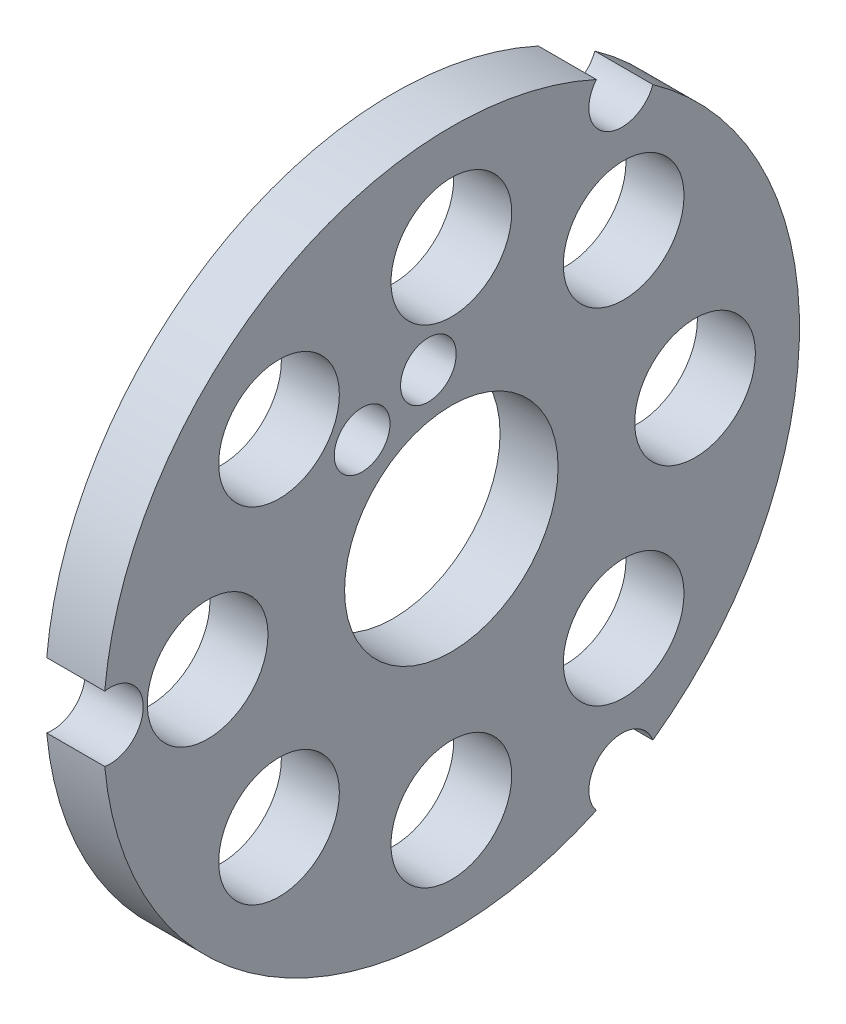
ISO-10303-21;
HEADER;
FILE_DESCRIPTION(('STEP AP214'),'2;1');
FILE_NAME('part.step','',(''),(''),'','','');
FILE_SCHEMA(('AUTOMOTIVE_DESIGN { 1 0 10303 214 1 1 1 1 }'));
ENDSEC;
DATA;
#1=APPLICATION_CONTEXT('core data for automotive mechanical design processes');
#2=APPLICATION_PROTOCOL_DEFINITION('international standard','automotive_design',2000,#1);
#3=PRODUCT_CONTEXT('',#1,'mechanical');
#4=PRODUCT('Part','Part','',(#3));
#5=PRODUCT_RELATED_PRODUCT_CATEGORY('part','',(#4));
#6=PRODUCT_DEFINITION_FORMATION('','',#4);
#7=PRODUCT_DEFINITION_CONTEXT('part definition',#1,'design');
#8=PRODUCT_DEFINITION('design','',#6,#7);
#9=PRODUCT_DEFINITION_SHAPE('','',#8);
#10=(LENGTH_UNIT() NAMED_UNIT(*) SI_UNIT(.MILLI.,.METRE.));
#11=(NAMED_UNIT(*) PLANE_ANGLE_UNIT() SI_UNIT($,.RADIAN.));
#12=(NAMED_UNIT(*) SI_UNIT($,.STERADIAN.) SOLID_ANGLE_UNIT());
#13=UNCERTAINTY_MEASURE_WITH_UNIT(LENGTH_MEASURE(1.E-05),#10,'distance_accuracy_value','');
#14=(GEOMETRIC_REPRESENTATION_CONTEXT(3) GLOBAL_UNCERTAINTY_ASSIGNED_CONTEXT((#13)) GLOBAL_UNIT_ASSIGNED_CONTEXT((#10,
#11,#12)) REPRESENTATION_CONTEXT('',''));
#15=CARTESIAN_POINT('',(0.,0.,0.));
#16=DIRECTION('',(0.,0.,1.));
#17=DIRECTION('',(1.,0.,0.));
#18=AXIS2_PLACEMENT_3D('',#15,#16,#17);
#19=CARTESIAN_POINT('',(-110.,0.,0.));
#20=DIRECTION('',(-1.,0.,0.));
#21=DIRECTION('',(0.,0.,1.));
#22=AXIS2_PLACEMENT_3D('',#19,#20,#21);
#23=CYLINDRICAL_SURFACE('',#22,30.);
#24=DIRECTION('',(-1.,0.,0.));
#25=VECTOR('',#24,1.);
#26=CARTESIAN_POINT('',(74.35,2.8113146971295,29.8679846938776));
#27=LINE('',#26,#25);
#28=CARTESIAN_POINT('',(148.7,2.8113146971295,29.8679846938776));
#29=VERTEX_POINT('',#28);
#30=CARTESIAN_POINT('',(143.7,2.81131469712949,29.8679846938776));
#31=VERTEX_POINT('',#30);
#32=EDGE_CURVE('E11',#29,#31,#27,.T.);
#33=ORIENTED_EDGE('',*,*,#32,.F.);
#34=CARTESIAN_POINT('',(148.7,0.,0.));
#35=DIRECTION('',(-1.,0.,0.));
#36=DIRECTION('',(0.,0.,1.));
#37=AXIS2_PLACEMENT_3D('',#34,#35,#36);
#38=CIRCLE('',#37,30.);
#39=CARTESIAN_POINT('',(148.7,27.2720908533075,-12.4993224011921));
#40=VERTEX_POINT('',#39);
#41=EDGE_CURVE('E112',#29,#40,#38,.T.);
#42=ORIENTED_EDGE('',*,*,#41,.T.);
#43=DIRECTION('',(-1.,0.,0.));
#44=VECTOR('',#43,1.);
#45=CARTESIAN_POINT('',(74.35,27.2720908533075,-12.4993224011921));
#46=LINE('',#45,#44);
#47=CARTESIAN_POINT('',(143.7,27.2720908533075,-12.4993224011921));
#48=VERTEX_POINT('',#47);
#49=EDGE_CURVE('E91',#48,#40,#46,.F.);
#50=ORIENTED_EDGE('',*,*,#49,.F.);
#51=CARTESIAN_POINT('',(143.7,0.,0.));
#52=DIRECTION('',(-1.,0.,0.));
#53=DIRECTION('',(0.,0.,1.));
#54=AXIS2_PLACEMENT_3D('',#51,#52,#53);
#55=CIRCLE('',#54,30.);
#56=EDGE_CURVE('E131',#31,#48,#55,.T.);
#57=ORIENTED_EDGE('',*,*,#56,.F.);
#58=EDGE_LOOP('',(#33,#42,#50,#57));
#59=FACE_BOUND('',#58,.T.);
#60=ADVANCED_FACE('F39',(#59),#23,.T.);
#61=DIRECTION('',(-1.,0.,0.));
#62=VECTOR('',#61,1.);
#63=CARTESIAN_POINT('',(74.35,-2.8113146971295,29.8679846938776));
#64=LINE('',#63,#62);
#65=CARTESIAN_POINT('',(143.7,-2.81131469712952,29.8679846938775));
#66=VERTEX_POINT('',#65);
#67=CARTESIAN_POINT('',(148.7,-2.8113146971295,29.8679846938776));
#68=VERTEX_POINT('',#67);
#69=EDGE_CURVE('E48',#66,#68,#64,.F.);
#70=ORIENTED_EDGE('',*,*,#69,.F.);
#71=CARTESIAN_POINT('',(143.7,-27.2720908533075,-12.4993224011921));
#72=VERTEX_POINT('',#71);
#73=EDGE_CURVE('E137',#72,#66,#55,.T.);
#74=ORIENTED_EDGE('',*,*,#73,.F.);
#75=DIRECTION('',(-1.,0.,0.));
#76=VECTOR('',#75,1.);
#77=CARTESIAN_POINT('',(74.35,-27.2720908533075,-12.4993224011921));
#78=LINE('',#77,#76);
#79=CARTESIAN_POINT('',(148.7,-27.2720908533075,-12.4993224011921));
#80=VERTEX_POINT('',#79);
#81=EDGE_CURVE('E272',#80,#72,#78,.T.);
#82=ORIENTED_EDGE('',*,*,#81,.F.);
#83=EDGE_CURVE('E123',#80,#68,#38,.T.);
#84=ORIENTED_EDGE('',*,*,#83,.T.);
#85=EDGE_LOOP('',(#70,#74,#82,#84));
#86=FACE_BOUND('',#85,.T.);
#87=ADVANCED_FACE('F257',(#86),#23,.T.);
#88=DIRECTION('',(-1.,0.,0.));
#89=VECTOR('',#88,1.);
#90=CARTESIAN_POINT('',(74.35,-24.460776156178,-17.3686622926855));
#91=LINE('',#90,#89);
#92=CARTESIAN_POINT('',(143.7,-24.460776156178,-17.3686622926855));
#93=VERTEX_POINT('',#92);
#94=CARTESIAN_POINT('',(148.7,-24.460776156178,-17.3686622926855));
#95=VERTEX_POINT('',#94);
#96=EDGE_CURVE('E270',#93,#95,#91,.F.);
#97=ORIENTED_EDGE('',*,*,#96,.F.);
#98=CARTESIAN_POINT('',(143.7,24.460776156178,-17.3686622926855));
#99=VERTEX_POINT('',#98);
#100=EDGE_CURVE('E136',#99,#93,#55,.T.);
#101=ORIENTED_EDGE('',*,*,#100,.F.);
#102=DIRECTION('',(-1.,0.,0.));
#103=VECTOR('',#102,1.);
#104=CARTESIAN_POINT('',(74.35,24.460776156178,-17.3686622926855));
#105=LINE('',#104,#103);
#106=CARTESIAN_POINT('',(148.7,24.460776156178,-17.3686622926855));
#107=VERTEX_POINT('',#106);
#108=EDGE_CURVE('E103',#107,#99,#105,.T.);
#109=ORIENTED_EDGE('',*,*,#108,.F.);
#110=EDGE_CURVE('E115',#107,#95,#38,.T.);
#111=ORIENTED_EDGE('',*,*,#110,.T.);
#112=EDGE_LOOP('',(#97,#101,#109,#111));
#113=FACE_BOUND('',#112,.T.);
#114=ADVANCED_FACE('F258',(#113),#23,.T.);
#115=CARTESIAN_POINT('',(143.7,30.,0.));
#116=DIRECTION('',(1.,0.,0.));
#117=DIRECTION('',(0.,0.,-1.));
#118=AXIS2_PLACEMENT_3D('',#115,#116,#117);
#119=PLANE('',#118);
#120=CARTESIAN_POINT('',(143.7,12.8487337040411,1.97738266469541));
#121=DIRECTION('',(1.,0.,0.));
#122=DIRECTION('',(0.,0.,-1.));
#123=AXIS2_PLACEMENT_3D('',#120,#121,#122);
#124=CIRCLE('',#123,2.4);
#125=CARTESIAN_POINT('',(143.7,12.8487337040411,-0.422617335304591));
#126=VERTEX_POINT('',#125);
#127=EDGE_CURVE('E144',#126,#126,#124,.F.);
#128=ORIENTED_EDGE('',*,*,#127,.F.);
#129=EDGE_LOOP('',(#128));
#130=FACE_BOUND('',#129,.T.);
#131=CARTESIAN_POINT('',(143.7,14.8492424049175,-14.8492424049175));
#132=DIRECTION('',(1.,0.,0.));
#133=DIRECTION('',(0.,0.,-1.));
#134=AXIS2_PLACEMENT_3D('',#131,#132,#133);
#135=CIRCLE('',#134,5.2);
#136=CARTESIAN_POINT('',(143.7,14.8492424049175,-20.0492424049175));
#137=VERTEX_POINT('',#136);
#138=EDGE_CURVE('E148',#137,#137,#135,.F.);
#139=ORIENTED_EDGE('',*,*,#138,.F.);
#140=EDGE_LOOP('',(#139));
#141=FACE_BOUND('',#140,.T.);
#142=CARTESIAN_POINT('',(143.7,0.,-21.));
#143=DIRECTION('',(1.,0.,0.));
#144=DIRECTION('',(0.,0.,-1.));
#145=AXIS2_PLACEMENT_3D('',#142,#143,#144);
#146=CIRCLE('',#145,5.2);
#147=CARTESIAN_POINT('',(143.7,0.,-26.2));
#148=VERTEX_POINT('',#147);
#149=EDGE_CURVE('E153',#148,#148,#146,.F.);
#150=ORIENTED_EDGE('',*,*,#149,.F.);
#151=EDGE_LOOP('',(#150));
#152=FACE_BOUND('',#151,.T.);
#153=CARTESIAN_POINT('',(143.7,-14.8492424049175,-14.8492424049175));
#154=DIRECTION('',(1.,0.,0.));
#155=DIRECTION('',(0.,0.,-1.));
#156=AXIS2_PLACEMENT_3D('',#153,#154,#155);
#157=CIRCLE('',#156,5.2);
#158=CARTESIAN_POINT('',(143.7,-14.8492424049175,-20.0492424049175));
#159=VERTEX_POINT('',#158);
#160=EDGE_CURVE('E159',#159,#159,#157,.F.);
#161=ORIENTED_EDGE('',*,*,#160,.F.);
#162=EDGE_LOOP('',(#161));
#163=FACE_BOUND('',#162,.T.);
#164=CARTESIAN_POINT('',(143.7,-21.,0.));
#165=DIRECTION('',(1.,0.,0.));
#166=DIRECTION('',(0.,0.,-1.));
#167=AXIS2_PLACEMENT_3D('',#164,#165,#166);
#168=CIRCLE('',#167,5.2);
#169=CARTESIAN_POINT('',(143.7,-21.,-5.2));
#170=VERTEX_POINT('',#169);
#171=EDGE_CURVE('E163',#170,#170,#168,.F.);
#172=ORIENTED_EDGE('',*,*,#171,.F.);
#173=EDGE_LOOP('',(#172));
#174=FACE_BOUND('',#173,.T.);
#175=CARTESIAN_POINT('',(143.7,-14.8492424049175,14.8492424049175));
#176=DIRECTION('',(1.,0.,0.));
#177=DIRECTION('',(0.,0.,-1.));
#178=AXIS2_PLACEMENT_3D('',#175,#176,#177);
#179=CIRCLE('',#178,5.2);
#180=CARTESIAN_POINT('',(143.7,-14.8492424049175,9.6492424049175));
#181=VERTEX_POINT('',#180);
#182=EDGE_CURVE('E167',#181,#181,#179,.F.);
#183=ORIENTED_EDGE('',*,*,#182,.F.);
#184=EDGE_LOOP('',(#183));
#185=FACE_BOUND('',#184,.T.);
#186=CARTESIAN_POINT('',(143.7,0.,21.));
#187=DIRECTION('',(1.,0.,0.));
#188=DIRECTION('',(0.,0.,-1.));
#189=AXIS2_PLACEMENT_3D('',#186,#187,#188);
#190=CIRCLE('',#189,5.2);
#191=CARTESIAN_POINT('',(143.7,0.,15.8));
#192=VERTEX_POINT('',#191);
#193=EDGE_CURVE('E171',#192,#192,#190,.F.);
#194=ORIENTED_EDGE('',*,*,#193,.F.);
#195=EDGE_LOOP('',(#194));
#196=FACE_BOUND('',#195,.T.);
#197=CARTESIAN_POINT('',(143.7,14.8492424049175,14.8492424049175));
#198=DIRECTION('',(1.,0.,0.));
#199=DIRECTION('',(0.,0.,-1.));
#200=AXIS2_PLACEMENT_3D('',#197,#198,#199);
#201=CIRCLE('',#200,5.2);
#202=CARTESIAN_POINT('',(143.7,14.8492424049175,9.6492424049175));
#203=VERTEX_POINT('',#202);
#204=EDGE_CURVE('E175',#203,#203,#201,.F.);
#205=ORIENTED_EDGE('',*,*,#204,.F.);
#206=EDGE_LOOP('',(#205));
#207=FACE_BOUND('',#206,.T.);
#208=CARTESIAN_POINT('',(143.7,10.4836474229945,7.68720604058077));
#209=DIRECTION('',(1.,0.,0.));
#210=DIRECTION('',(0.,0.,-1.));
#211=AXIS2_PLACEMENT_3D('',#208,#209,#210);
#212=CIRCLE('',#211,2.4);
#213=CARTESIAN_POINT('',(143.7,10.4836474229945,5.28720604058077));
#214=VERTEX_POINT('',#213);
#215=EDGE_CURVE('E179',#214,#214,#212,.F.);
#216=ORIENTED_EDGE('',*,*,#215,.F.);
#217=EDGE_LOOP('',(#216));
#218=FACE_BOUND('',#217,.T.);
#219=CARTESIAN_POINT('',(143.7,0.,29.4));
#220=DIRECTION('',(1.,0.,0.));
#221=DIRECTION('',(0.,0.,-1.));
#222=AXIS2_PLACEMENT_3D('',#219,#220,#221);
#223=CIRCLE('',#222,2.85);
#224=EDGE_CURVE('E54',#31,#66,#223,.F.);
#225=ORIENTED_EDGE('',*,*,#224,.F.);
#226=ORIENTED_EDGE('',*,*,#56,.T.);
#227=CARTESIAN_POINT('',(143.7,25.4611468712625,-14.7));
#228=DIRECTION('',(1.,0.,0.));
#229=DIRECTION('',(0.,0.,-1.));
#230=AXIS2_PLACEMENT_3D('',#227,#228,#229);
#231=CIRCLE('',#230,2.85);
#232=EDGE_CURVE('E97',#99,#48,#231,.F.);
#233=ORIENTED_EDGE('',*,*,#232,.F.);
#234=ORIENTED_EDGE('',*,*,#100,.T.);
#235=CARTESIAN_POINT('',(143.7,-25.4611468712625,-14.7));
#236=DIRECTION('',(1.,0.,0.));
#237=DIRECTION('',(0.,0.,-1.));
#238=AXIS2_PLACEMENT_3D('',#235,#236,#237);
#239=CIRCLE('',#238,2.85);
#240=EDGE_CURVE('E62',#72,#93,#239,.F.);
#241=ORIENTED_EDGE('',*,*,#240,.F.);
#242=ORIENTED_EDGE('',*,*,#73,.T.);
#243=EDGE_LOOP('',(#225,#226,#233,#234,#241,#242));
#244=FACE_BOUND('',#243,.T.);
#245=CARTESIAN_POINT('',(143.7,21.,0.));
#246=DIRECTION('',(1.,0.,0.));
#247=DIRECTION('',(0.,0.,-1.));
#248=AXIS2_PLACEMENT_3D('',#245,#246,#247);
#249=CIRCLE('',#248,5.2);
#250=CARTESIAN_POINT('',(143.7,21.,-5.2));
#251=VERTEX_POINT('',#250);
#252=EDGE_CURVE('E183',#251,#251,#249,.F.);
#253=ORIENTED_EDGE('',*,*,#252,.F.);
#254=EDGE_LOOP('',(#253));
#255=FACE_BOUND('',#254,.T.);
#256=CARTESIAN_POINT('',(143.7,0.,0.));
#257=DIRECTION('',(-1.,0.,0.));
#258=DIRECTION('',(0.,0.,1.));
#259=AXIS2_PLACEMENT_3D('',#256,#257,#258);
#260=CIRCLE('',#259,9.2);
#261=CARTESIAN_POINT('',(143.7,0.,9.2));
#262=VERTEX_POINT('',#261);
#263=EDGE_CURVE('E104',#262,#262,#260,.T.);
#264=ORIENTED_EDGE('',*,*,#263,.F.);
#265=EDGE_LOOP('',(#264));
#266=FACE_BOUND('',#265,.T.);
#267=ADVANCED_FACE('F41',(#130,#141,#152,#163,#174,#185,#196,#207,#218,#244,#255,#266),#119,.F.);
#268=CARTESIAN_POINT('',(-110.,0.,0.));
#269=DIRECTION('',(-1.,0.,0.));
#270=DIRECTION('',(0.,0.,1.));
#271=AXIS2_PLACEMENT_3D('',#268,#269,#270);
#272=CYLINDRICAL_SURFACE('',#271,9.2);
#273=CARTESIAN_POINT('',(148.7,0.,0.));
#274=DIRECTION('',(-1.,0.,0.));
#275=DIRECTION('',(0.,0.,1.));
#276=AXIS2_PLACEMENT_3D('',#273,#274,#275);
#277=CIRCLE('',#276,9.2);
#278=CARTESIAN_POINT('',(148.7,0.,9.2));
#279=VERTEX_POINT('',#278);
#280=EDGE_CURVE('E121',#279,#279,#277,.T.);
#281=ORIENTED_EDGE('',*,*,#280,.F.);
#282=EDGE_LOOP('',(#281));
#283=FACE_BOUND('',#282,.T.);
#284=ORIENTED_EDGE('',*,*,#263,.T.);
#285=EDGE_LOOP('',(#284));
#286=FACE_BOUND('',#285,.T.);
#287=ADVANCED_FACE('F243',(#283,#286),#272,.F.);
#288=CARTESIAN_POINT('',(148.7,9.2,0.));
#289=DIRECTION('',(-1.,0.,0.));
#290=DIRECTION('',(0.,0.,1.));
#291=AXIS2_PLACEMENT_3D('',#288,#289,#290);
#292=PLANE('',#291);
#293=CARTESIAN_POINT('',(148.7,12.8487337040411,1.97738266469541));
#294=DIRECTION('',(1.,0.,0.));
#295=DIRECTION('',(0.,0.,-1.));
#296=AXIS2_PLACEMENT_3D('',#293,#294,#295);
#297=CIRCLE('',#296,2.4);
#298=CARTESIAN_POINT('',(148.7,12.8487337040411,-0.422617335304591));
#299=VERTEX_POINT('',#298);
#300=EDGE_CURVE('E214',#299,#299,#297,.T.);
#301=ORIENTED_EDGE('',*,*,#300,.F.);
#302=EDGE_LOOP('',(#301));
#303=FACE_BOUND('',#302,.T.);
#304=CARTESIAN_POINT('',(148.7,14.8492424049175,-14.8492424049175));
#305=DIRECTION('',(1.,0.,0.));
#306=DIRECTION('',(0.,0.,-1.));
#307=AXIS2_PLACEMENT_3D('',#304,#305,#306);
#308=CIRCLE('',#307,5.2);
#309=CARTESIAN_POINT('',(148.7,14.8492424049175,-20.0492424049175));
#310=VERTEX_POINT('',#309);
#311=EDGE_CURVE('E218',#310,#310,#308,.T.);
#312=ORIENTED_EDGE('',*,*,#311,.F.);
#313=EDGE_LOOP('',(#312));
#314=FACE_BOUND('',#313,.T.);
#315=CARTESIAN_POINT('',(148.7,0.,-21.));
#316=DIRECTION('',(1.,0.,0.));
#317=DIRECTION('',(0.,0.,-1.));
#318=AXIS2_PLACEMENT_3D('',#315,#316,#317);
#319=CIRCLE('',#318,5.2);
#320=CARTESIAN_POINT('',(148.7,0.,-26.2));
#321=VERTEX_POINT('',#320);
#322=EDGE_CURVE('E223',#321,#321,#319,.T.);
#323=ORIENTED_EDGE('',*,*,#322,.F.);
#324=EDGE_LOOP('',(#323));
#325=FACE_BOUND('',#324,.T.);
#326=CARTESIAN_POINT('',(148.7,-14.8492424049175,-14.8492424049175));
#327=DIRECTION('',(1.,0.,0.));
#328=DIRECTION('',(0.,0.,-1.));
#329=AXIS2_PLACEMENT_3D('',#326,#327,#328);
#330=CIRCLE('',#329,5.2);
#331=CARTESIAN_POINT('',(148.7,-14.8492424049175,-20.0492424049175));
#332=VERTEX_POINT('',#331);
#333=EDGE_CURVE('E203',#332,#332,#330,.T.);
#334=ORIENTED_EDGE('',*,*,#333,.F.);
#335=EDGE_LOOP('',(#334));
#336=FACE_BOUND('',#335,.T.);
#337=CARTESIAN_POINT('',(148.7,-21.,0.));
#338=DIRECTION('',(1.,0.,0.));
#339=DIRECTION('',(0.,0.,-1.));
#340=AXIS2_PLACEMENT_3D('',#337,#338,#339);
#341=CIRCLE('',#340,5.2);
#342=CARTESIAN_POINT('',(148.7,-21.,-5.2));
#343=VERTEX_POINT('',#342);
#344=EDGE_CURVE('E198',#343,#343,#341,.T.);
#345=ORIENTED_EDGE('',*,*,#344,.F.);
#346=EDGE_LOOP('',(#345));
#347=FACE_BOUND('',#346,.T.);
#348=CARTESIAN_POINT('',(148.7,-14.8492424049175,14.8492424049175));
#349=DIRECTION('',(1.,0.,0.));
#350=DIRECTION('',(0.,0.,-1.));
#351=AXIS2_PLACEMENT_3D('',#348,#349,#350);
#352=CIRCLE('',#351,5.2);
#353=CARTESIAN_POINT('',(148.7,-14.8492424049175,9.6492424049175));
#354=VERTEX_POINT('',#353);
#355=EDGE_CURVE('E202',#354,#354,#352,.T.);
#356=ORIENTED_EDGE('',*,*,#355,.F.);
#357=EDGE_LOOP('',(#356));
#358=FACE_BOUND('',#357,.T.);
#359=CARTESIAN_POINT('',(148.7,0.,21.));
#360=DIRECTION('',(1.,0.,0.));
#361=DIRECTION('',(0.,0.,-1.));
#362=AXIS2_PLACEMENT_3D('',#359,#360,#361);
#363=CIRCLE('',#362,5.2);
#364=CARTESIAN_POINT('',(148.7,0.,15.8));
#365=VERTEX_POINT('',#364);
#366=EDGE_CURVE('E207',#365,#365,#363,.T.);
#367=ORIENTED_EDGE('',*,*,#366,.F.);
#368=EDGE_LOOP('',(#367));
#369=FACE_BOUND('',#368,.T.);
#370=CARTESIAN_POINT('',(148.7,14.8492424049175,14.8492424049175));
#371=DIRECTION('',(1.,0.,0.));
#372=DIRECTION('',(0.,0.,-1.));
#373=AXIS2_PLACEMENT_3D('',#370,#371,#372);
#374=CIRCLE('',#373,5.2);
#375=CARTESIAN_POINT('',(148.7,14.8492424049175,9.6492424049175));
#376=VERTEX_POINT('',#375);
#377=EDGE_CURVE('E197',#376,#376,#374,.T.);
#378=ORIENTED_EDGE('',*,*,#377,.F.);
#379=EDGE_LOOP('',(#378));
#380=FACE_BOUND('',#379,.T.);
#381=CARTESIAN_POINT('',(148.7,10.4836474229945,7.68720604058077));
#382=DIRECTION('',(1.,0.,0.));
#383=DIRECTION('',(0.,0.,-1.));
#384=AXIS2_PLACEMENT_3D('',#381,#382,#383);
#385=CIRCLE('',#384,2.4);
#386=CARTESIAN_POINT('',(148.7,10.4836474229945,5.28720604058077));
#387=VERTEX_POINT('',#386);
#388=EDGE_CURVE('E219',#387,#387,#385,.T.);
#389=ORIENTED_EDGE('',*,*,#388,.F.);
#390=EDGE_LOOP('',(#389));
#391=FACE_BOUND('',#390,.T.);
#392=CARTESIAN_POINT('',(148.7,0.,29.4));
#393=DIRECTION('',(1.,0.,0.));
#394=DIRECTION('',(0.,0.,-1.));
#395=AXIS2_PLACEMENT_3D('',#392,#393,#394);
#396=CIRCLE('',#395,2.85);
#397=EDGE_CURVE('E232',#68,#29,#396,.T.);
#398=ORIENTED_EDGE('',*,*,#397,.F.);
#399=ORIENTED_EDGE('',*,*,#83,.F.);
#400=CARTESIAN_POINT('',(148.7,-25.4611468712625,-14.7));
#401=DIRECTION('',(1.,0.,0.));
#402=DIRECTION('',(0.,0.,-1.));
#403=AXIS2_PLACEMENT_3D('',#400,#401,#402);
#404=CIRCLE('',#403,2.85);
#405=EDGE_CURVE('E117',#95,#80,#404,.T.);
#406=ORIENTED_EDGE('',*,*,#405,.F.);
#407=ORIENTED_EDGE('',*,*,#110,.F.);
#408=CARTESIAN_POINT('',(148.7,25.4611468712625,-14.7));
#409=DIRECTION('',(1.,0.,0.));
#410=DIRECTION('',(0.,0.,-1.));
#411=AXIS2_PLACEMENT_3D('',#408,#409,#410);
#412=CIRCLE('',#411,2.85);
#413=EDGE_CURVE('E94',#40,#107,#412,.T.);
#414=ORIENTED_EDGE('',*,*,#413,.F.);
#415=ORIENTED_EDGE('',*,*,#41,.F.);
#416=EDGE_LOOP('',(#398,#399,#406,#407,#414,#415));
#417=FACE_BOUND('',#416,.T.);
#418=CARTESIAN_POINT('',(148.7,21.,0.));
#419=DIRECTION('',(1.,0.,0.));
#420=DIRECTION('',(0.,0.,-1.));
#421=AXIS2_PLACEMENT_3D('',#418,#419,#420);
#422=CIRCLE('',#421,5.2);
#423=CARTESIAN_POINT('',(148.7,21.,-5.2));
#424=VERTEX_POINT('',#423);
#425=EDGE_CURVE('E193',#424,#424,#422,.T.);
#426=ORIENTED_EDGE('',*,*,#425,.F.);
#427=EDGE_LOOP('',(#426));
#428=FACE_BOUND('',#427,.T.);
#429=ORIENTED_EDGE('',*,*,#280,.T.);
#430=EDGE_LOOP('',(#429));
#431=FACE_BOUND('',#430,.T.);
#432=ADVANCED_FACE('F110',(#303,#314,#325,#336,#347,#358,#369,#380,#391,#417,#428,#431),#292,.F.);
#433=CARTESIAN_POINT('',(148.7,25.4611468712625,-14.7));
#434=DIRECTION('',(-1.,0.,0.));
#435=DIRECTION('',(0.,0.,1.));
#436=AXIS2_PLACEMENT_3D('',#433,#434,#435);
#437=CYLINDRICAL_SURFACE('',#436,2.85);
#438=ORIENTED_EDGE('',*,*,#108,.T.);
#439=ORIENTED_EDGE('',*,*,#232,.T.);
#440=ORIENTED_EDGE('',*,*,#49,.T.);
#441=ORIENTED_EDGE('',*,*,#413,.T.);
#442=EDGE_LOOP('',(#438,#439,#440,#441));
#443=FACE_BOUND('',#442,.T.);
#444=ADVANCED_FACE('F93',(#443),#437,.F.);
#445=CARTESIAN_POINT('',(148.7,-25.4611468712625,-14.7));
#446=DIRECTION('',(-1.,0.,0.));
#447=DIRECTION('',(0.,0.,1.));
#448=AXIS2_PLACEMENT_3D('',#445,#446,#447);
#449=CYLINDRICAL_SURFACE('',#448,2.85);
#450=ORIENTED_EDGE('',*,*,#81,.T.);
#451=ORIENTED_EDGE('',*,*,#240,.T.);
#452=ORIENTED_EDGE('',*,*,#96,.T.);
#453=ORIENTED_EDGE('',*,*,#405,.T.);
#454=EDGE_LOOP('',(#450,#451,#452,#453));
#455=FACE_BOUND('',#454,.T.);
#456=ADVANCED_FACE('F250',(#455),#449,.F.);
#457=CARTESIAN_POINT('',(148.7,0.,29.4));
#458=DIRECTION('',(-1.,0.,0.));
#459=DIRECTION('',(0.,0.,1.));
#460=AXIS2_PLACEMENT_3D('',#457,#458,#459);
#461=CYLINDRICAL_SURFACE('',#460,2.85);
#462=ORIENTED_EDGE('',*,*,#32,.T.);
#463=ORIENTED_EDGE('',*,*,#224,.T.);
#464=ORIENTED_EDGE('',*,*,#69,.T.);
#465=ORIENTED_EDGE('',*,*,#397,.T.);
#466=EDGE_LOOP('',(#462,#463,#464,#465));
#467=FACE_BOUND('',#466,.T.);
#468=ADVANCED_FACE('F286',(#467),#461,.F.);
#469=CARTESIAN_POINT('',(148.7,21.,0.));
#470=DIRECTION('',(-1.,0.,0.));
#471=DIRECTION('',(0.,0.,1.));
#472=AXIS2_PLACEMENT_3D('',#469,#470,#471);
#473=CYLINDRICAL_SURFACE('',#472,5.2);
#474=ORIENTED_EDGE('',*,*,#425,.T.);
#475=EDGE_LOOP('',(#474));
#476=FACE_BOUND('',#475,.T.);
#477=ORIENTED_EDGE('',*,*,#252,.T.);
#478=EDGE_LOOP('',(#477));
#479=FACE_BOUND('',#478,.T.);
#480=ADVANCED_FACE('F288',(#476,#479),#473,.F.);
#481=CARTESIAN_POINT('',(148.7,10.4836474229945,7.68720604058077));
#482=DIRECTION('',(-1.,0.,0.));
#483=DIRECTION('',(0.,0.,1.));
#484=AXIS2_PLACEMENT_3D('',#481,#482,#483);
#485=CYLINDRICAL_SURFACE('',#484,2.4);
#486=ORIENTED_EDGE('',*,*,#388,.T.);
#487=EDGE_LOOP('',(#486));
#488=FACE_BOUND('',#487,.T.);
#489=ORIENTED_EDGE('',*,*,#215,.T.);
#490=EDGE_LOOP('',(#489));
#491=FACE_BOUND('',#490,.T.);
#492=ADVANCED_FACE('F239',(#488,#491),#485,.F.);
#493=CARTESIAN_POINT('',(148.7,14.8492424049175,14.8492424049175));
#494=DIRECTION('',(-1.,0.,0.));
#495=DIRECTION('',(0.,0.,1.));
#496=AXIS2_PLACEMENT_3D('',#493,#494,#495);
#497=CYLINDRICAL_SURFACE('',#496,5.2);
#498=ORIENTED_EDGE('',*,*,#377,.T.);
#499=EDGE_LOOP('',(#498));
#500=FACE_BOUND('',#499,.T.);
#501=ORIENTED_EDGE('',*,*,#204,.T.);
#502=EDGE_LOOP('',(#501));
#503=FACE_BOUND('',#502,.T.);
#504=ADVANCED_FACE('F315',(#500,#503),#497,.F.);
#505=CARTESIAN_POINT('',(148.7,0.,21.));
#506=DIRECTION('',(-1.,0.,0.));
#507=DIRECTION('',(0.,0.,1.));
#508=AXIS2_PLACEMENT_3D('',#505,#506,#507);
#509=CYLINDRICAL_SURFACE('',#508,5.2);
#510=ORIENTED_EDGE('',*,*,#366,.T.);
#511=EDGE_LOOP('',(#510));
#512=FACE_BOUND('',#511,.T.);
#513=ORIENTED_EDGE('',*,*,#193,.T.);
#514=EDGE_LOOP('',(#513));
#515=FACE_BOUND('',#514,.T.);
#516=ADVANCED_FACE('F318',(#512,#515),#509,.F.);
#517=CARTESIAN_POINT('',(148.7,-14.8492424049175,14.8492424049175));
#518=DIRECTION('',(-1.,0.,0.));
#519=DIRECTION('',(0.,0.,1.));
#520=AXIS2_PLACEMENT_3D('',#517,#518,#519);
#521=CYLINDRICAL_SURFACE('',#520,5.2);
#522=ORIENTED_EDGE('',*,*,#355,.T.);
#523=EDGE_LOOP('',(#522));
#524=FACE_BOUND('',#523,.T.);
#525=ORIENTED_EDGE('',*,*,#182,.T.);
#526=EDGE_LOOP('',(#525));
#527=FACE_BOUND('',#526,.T.);
#528=ADVANCED_FACE('F322',(#524,#527),#521,.F.);
#529=CARTESIAN_POINT('',(148.7,-21.,0.));
#530=DIRECTION('',(-1.,0.,0.));
#531=DIRECTION('',(0.,0.,1.));
#532=AXIS2_PLACEMENT_3D('',#529,#530,#531);
#533=CYLINDRICAL_SURFACE('',#532,5.2);
#534=ORIENTED_EDGE('',*,*,#344,.T.);
#535=EDGE_LOOP('',(#534));
#536=FACE_BOUND('',#535,.T.);
#537=ORIENTED_EDGE('',*,*,#171,.T.);
#538=EDGE_LOOP('',(#537));
#539=FACE_BOUND('',#538,.T.);
#540=ADVANCED_FACE('F302',(#536,#539),#533,.F.);
#541=CARTESIAN_POINT('',(148.7,-14.8492424049175,-14.8492424049175));
#542=DIRECTION('',(-1.,0.,0.));
#543=DIRECTION('',(0.,0.,1.));
#544=AXIS2_PLACEMENT_3D('',#541,#542,#543);
#545=CYLINDRICAL_SURFACE('',#544,5.2);
#546=ORIENTED_EDGE('',*,*,#333,.T.);
#547=EDGE_LOOP('',(#546));
#548=FACE_BOUND('',#547,.T.);
#549=ORIENTED_EDGE('',*,*,#160,.T.);
#550=EDGE_LOOP('',(#549));
#551=FACE_BOUND('',#550,.T.);
#552=ADVANCED_FACE('F298',(#548,#551),#545,.F.);
#553=CARTESIAN_POINT('',(148.7,0.,-21.));
#554=DIRECTION('',(-1.,0.,0.));
#555=DIRECTION('',(0.,0.,1.));
#556=AXIS2_PLACEMENT_3D('',#553,#554,#555);
#557=CYLINDRICAL_SURFACE('',#556,5.2);
#558=ORIENTED_EDGE('',*,*,#322,.T.);
#559=EDGE_LOOP('',(#558));
#560=FACE_BOUND('',#559,.T.);
#561=ORIENTED_EDGE('',*,*,#149,.T.);
#562=EDGE_LOOP('',(#561));
#563=FACE_BOUND('',#562,.T.);
#564=ADVANCED_FACE('F301',(#560,#563),#557,.F.);
#565=CARTESIAN_POINT('',(148.7,14.8492424049175,-14.8492424049175));
#566=DIRECTION('',(-1.,0.,0.));
#567=DIRECTION('',(0.,0.,1.));
#568=AXIS2_PLACEMENT_3D('',#565,#566,#567);
#569=CYLINDRICAL_SURFACE('',#568,5.2);
#570=ORIENTED_EDGE('',*,*,#311,.T.);
#571=EDGE_LOOP('',(#570));
#572=FACE_BOUND('',#571,.T.);
#573=ORIENTED_EDGE('',*,*,#138,.T.);
#574=EDGE_LOOP('',(#573));
#575=FACE_BOUND('',#574,.T.);
#576=ADVANCED_FACE('F306',(#572,#575),#569,.F.);
#577=CARTESIAN_POINT('',(148.7,12.8487337040411,1.97738266469541));
#578=DIRECTION('',(-1.,0.,0.));
#579=DIRECTION('',(0.,0.,1.));
#580=AXIS2_PLACEMENT_3D('',#577,#578,#579);
#581=CYLINDRICAL_SURFACE('',#580,2.4);
#582=ORIENTED_EDGE('',*,*,#300,.T.);
#583=EDGE_LOOP('',(#582));
#584=FACE_BOUND('',#583,.T.);
#585=ORIENTED_EDGE('',*,*,#127,.T.);
#586=EDGE_LOOP('',(#585));
#587=FACE_BOUND('',#586,.T.);
#588=ADVANCED_FACE('F310',(#584,#587),#581,.F.);
#589=CLOSED_SHELL('',(#60,#87,#114,#267,#287,#432,#444,#456,#468,#480,#492,#504,#516,#528,#540,
#552,#564,#576,#588));
#590=MANIFOLD_SOLID_BREP('B2',#589);
#591=ADVANCED_BREP_SHAPE_REPRESENTATION('',(#18,#590),#14);
#592=SHAPE_DEFINITION_REPRESENTATION(#9,#591);
ENDSEC;
END-ISO-10303-21;
